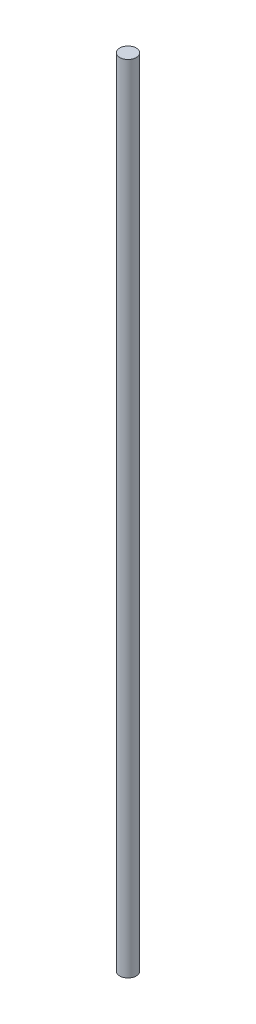
ISO-10303-21;
HEADER;
FILE_DESCRIPTION(('STEP AP214'),'2;1');
FILE_NAME('part.step','',(''),(''),'','','');
FILE_SCHEMA(('AUTOMOTIVE_DESIGN { 1 0 10303 214 1 1 1 1 }'));
ENDSEC;
DATA;
#1=APPLICATION_CONTEXT('core data for automotive mechanical design processes');
#2=APPLICATION_PROTOCOL_DEFINITION('international standard','automotive_design',2000,#1);
#3=PRODUCT_CONTEXT('',#1,'mechanical');
#4=PRODUCT('Part','Part','',(#3));
#5=PRODUCT_RELATED_PRODUCT_CATEGORY('part','',(#4));
#6=PRODUCT_DEFINITION_FORMATION('','',#4);
#7=PRODUCT_DEFINITION_CONTEXT('part definition',#1,'design');
#8=PRODUCT_DEFINITION('design','',#6,#7);
#9=PRODUCT_DEFINITION_SHAPE('','',#8);
#10=(LENGTH_UNIT() NAMED_UNIT(*) SI_UNIT(.MILLI.,.METRE.));
#11=(NAMED_UNIT(*) PLANE_ANGLE_UNIT() SI_UNIT($,.RADIAN.));
#12=(NAMED_UNIT(*) SI_UNIT($,.STERADIAN.) SOLID_ANGLE_UNIT());
#13=UNCERTAINTY_MEASURE_WITH_UNIT(LENGTH_MEASURE(1.E-05),#10,'distance_accuracy_value','');
#14=(GEOMETRIC_REPRESENTATION_CONTEXT(3) GLOBAL_UNCERTAINTY_ASSIGNED_CONTEXT((#13)) GLOBAL_UNIT_ASSIGNED_CONTEXT((#10,
#11,#12)) REPRESENTATION_CONTEXT('',''));
#15=CARTESIAN_POINT('',(0.,0.,0.));
#16=DIRECTION('',(0.,0.,1.));
#17=DIRECTION('',(1.,0.,0.));
#18=AXIS2_PLACEMENT_3D('',#15,#16,#17);
#19=CARTESIAN_POINT('',(0.,385.,0.));
#20=DIRECTION('',(0.,-1.,0.));
#21=DIRECTION('',(0.,0.,-1.));
#22=AXIS2_PLACEMENT_3D('',#19,#20,#21);
#23=CYLINDRICAL_SURFACE('',#22,4.);
#24=CARTESIAN_POINT('',(0.,385.,0.));
#25=DIRECTION('',(0.,1.,0.));
#26=DIRECTION('',(0.,0.,1.));
#27=AXIS2_PLACEMENT_3D('',#24,#25,#26);
#28=CIRCLE('',#27,4.);
#29=CARTESIAN_POINT('',(0.,385.,4.));
#30=VERTEX_POINT('',#29);
#31=EDGE_CURVE('E10',#30,#30,#28,.T.);
#32=ORIENTED_EDGE('',*,*,#31,.F.);
#33=EDGE_LOOP('',(#32));
#34=FACE_BOUND('',#33,.T.);
#35=CARTESIAN_POINT('',(0.,0.,0.));
#36=DIRECTION('',(0.,1.,0.));
#37=DIRECTION('',(0.,0.,1.));
#38=AXIS2_PLACEMENT_3D('',#35,#36,#37);
#39=CIRCLE('',#38,4.);
#40=CARTESIAN_POINT('',(0.,0.,4.));
#41=VERTEX_POINT('',#40);
#42=EDGE_CURVE('E38',#41,#41,#39,.T.);
#43=ORIENTED_EDGE('',*,*,#42,.T.);
#44=EDGE_LOOP('',(#43));
#45=FACE_BOUND('',#44,.T.);
#46=ADVANCED_FACE('F35',(#34,#45),#23,.T.);
#47=CARTESIAN_POINT('',(0.,385.,0.));
#48=DIRECTION('',(0.,1.,0.));
#49=DIRECTION('',(0.,0.,1.));
#50=AXIS2_PLACEMENT_3D('',#47,#48,#49);
#51=PLANE('',#50);
#52=ORIENTED_EDGE('',*,*,#31,.T.);
#53=EDGE_LOOP('',(#52));
#54=FACE_BOUND('',#53,.T.);
#55=ADVANCED_FACE('F50',(#54),#51,.T.);
#56=CARTESIAN_POINT('',(0.,0.,0.));
#57=DIRECTION('',(0.,1.,0.));
#58=DIRECTION('',(0.,0.,1.));
#59=AXIS2_PLACEMENT_3D('',#56,#57,#58);
#60=PLANE('',#59);
#61=ORIENTED_EDGE('',*,*,#42,.F.);
#62=EDGE_LOOP('',(#61));
#63=FACE_BOUND('',#62,.T.);
#64=ADVANCED_FACE('F48',(#63),#60,.F.);
#65=CLOSED_SHELL('',(#46,#55,#64));
#66=MANIFOLD_SOLID_BREP('B2',#65);
#67=ADVANCED_BREP_SHAPE_REPRESENTATION('',(#18,#66),#14);
#68=SHAPE_DEFINITION_REPRESENTATION(#9,#67);
ENDSEC;
END-ISO-10303-21;
